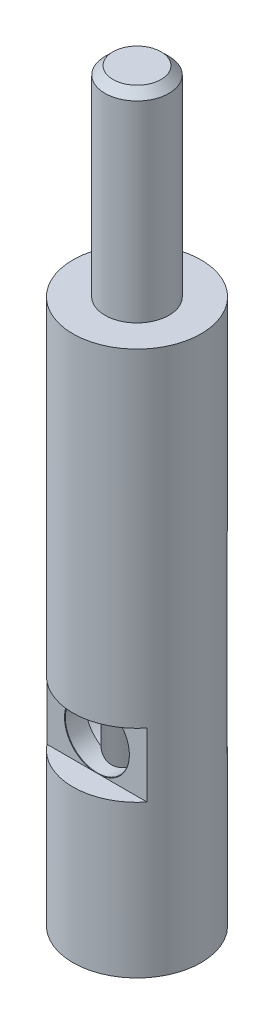
ISO-10303-21;
HEADER;
FILE_DESCRIPTION(('STEP AP214'),'2;1');
FILE_NAME('part.step','',(''),(''),'','','');
FILE_SCHEMA(('AUTOMOTIVE_DESIGN { 1 0 10303 214 1 1 1 1 }'));
ENDSEC;
DATA;
#1=APPLICATION_CONTEXT('core data for automotive mechanical design processes');
#2=APPLICATION_PROTOCOL_DEFINITION('international standard','automotive_design',2000,#1);
#3=PRODUCT_CONTEXT('',#1,'mechanical');
#4=PRODUCT('Part','Part','',(#3));
#5=PRODUCT_RELATED_PRODUCT_CATEGORY('part','',(#4));
#6=PRODUCT_DEFINITION_FORMATION('','',#4);
#7=PRODUCT_DEFINITION_CONTEXT('part definition',#1,'design');
#8=PRODUCT_DEFINITION('design','',#6,#7);
#9=PRODUCT_DEFINITION_SHAPE('','',#8);
#10=(LENGTH_UNIT() NAMED_UNIT(*) SI_UNIT(.MILLI.,.METRE.));
#11=(NAMED_UNIT(*) PLANE_ANGLE_UNIT() SI_UNIT($,.RADIAN.));
#12=(NAMED_UNIT(*) SI_UNIT($,.STERADIAN.) SOLID_ANGLE_UNIT());
#13=UNCERTAINTY_MEASURE_WITH_UNIT(LENGTH_MEASURE(1.E-05),#10,'distance_accuracy_value','');
#14=(GEOMETRIC_REPRESENTATION_CONTEXT(3) GLOBAL_UNCERTAINTY_ASSIGNED_CONTEXT((#13)) GLOBAL_UNIT_ASSIGNED_CONTEXT((#10,
#11,#12)) REPRESENTATION_CONTEXT('',''));
#15=CARTESIAN_POINT('',(0.,0.,0.));
#16=DIRECTION('',(0.,0.,1.));
#17=DIRECTION('',(1.,0.,0.));
#18=AXIS2_PLACEMENT_3D('',#15,#16,#17);
#19=CARTESIAN_POINT('',(-4.,13.5,2.5));
#20=DIRECTION('',(0.,0.,-1.));
#21=DIRECTION('',(0.,1.,0.));
#22=AXIS2_PLACEMENT_3D('',#19,#20,#21);
#23=PLANE('',#22);
#24=DIRECTION('',(1.,0.,0.));
#25=VECTOR('',#24,1.);
#26=CARTESIAN_POINT('',(-4.,13.5,2.5));
#27=LINE('',#26,#25);
#28=CARTESIAN_POINT('',(0.317214438511246,13.5,2.5));
#29=VERTEX_POINT('',#28);
#30=CARTESIAN_POINT('',(3.1224989991992,13.5,2.5));
#31=VERTEX_POINT('',#30);
#32=EDGE_CURVE('E130',#29,#31,#27,.T.);
#33=ORIENTED_EDGE('',*,*,#32,.F.);
#34=CARTESIAN_POINT('',(0.,11.5,2.5));
#35=DIRECTION('',(0.,0.,1.));
#36=DIRECTION('',(1.,0.,0.));
#37=AXIS2_PLACEMENT_3D('',#34,#35,#36);
#38=CIRCLE('',#37,2.025);
#39=CARTESIAN_POINT('',(0.317214438511237,9.5,2.5));
#40=VERTEX_POINT('',#39);
#41=EDGE_CURVE('E140',#40,#29,#38,.T.);
#42=ORIENTED_EDGE('',*,*,#41,.F.);
#43=DIRECTION('',(1.,0.,0.));
#44=VECTOR('',#43,1.);
#45=CARTESIAN_POINT('',(-4.,9.5,2.5));
#46=LINE('',#45,#44);
#47=CARTESIAN_POINT('',(3.1224989991992,9.5,2.5));
#48=VERTEX_POINT('',#47);
#49=EDGE_CURVE('E158',#40,#48,#46,.T.);
#50=ORIENTED_EDGE('',*,*,#49,.T.);
#51=DIRECTION('',(0.,-1.,0.));
#52=VECTOR('',#51,1.);
#53=CARTESIAN_POINT('',(3.1224989991992,34.,2.5));
#54=LINE('',#53,#52);
#55=EDGE_CURVE('E217',#31,#48,#54,.T.);
#56=ORIENTED_EDGE('',*,*,#55,.F.);
#57=EDGE_LOOP('',(#33,#42,#50,#56));
#58=FACE_BOUND('',#57,.T.);
#59=ADVANCED_FACE('F50',(#58),#23,.F.);
#60=CARTESIAN_POINT('',(0.,34.,0.));
#61=DIRECTION('',(0.,-1.,0.));
#62=DIRECTION('',(0.,0.,-1.));
#63=AXIS2_PLACEMENT_3D('',#60,#61,#62);
#64=CYLINDRICAL_SURFACE('',#63,4.);
#65=ORIENTED_EDGE('',*,*,#55,.T.);
#66=CARTESIAN_POINT('',(0.,9.5,0.));
#67=DIRECTION('',(0.,-1.,0.));
#68=DIRECTION('',(0.,0.,-1.));
#69=AXIS2_PLACEMENT_3D('',#66,#67,#68);
#70=CIRCLE('',#69,4.);
#71=CARTESIAN_POINT('',(-3.1224989991992,9.5,2.5));
#72=VERTEX_POINT('',#71);
#73=EDGE_CURVE('E221',#48,#72,#70,.T.);
#74=ORIENTED_EDGE('',*,*,#73,.T.);
#75=DIRECTION('',(0.,-1.,0.));
#76=VECTOR('',#75,1.);
#77=CARTESIAN_POINT('',(-3.1224989991992,34.,2.5));
#78=LINE('',#77,#76);
#79=CARTESIAN_POINT('',(-3.1224989991992,13.5,2.5));
#80=VERTEX_POINT('',#79);
#81=EDGE_CURVE('E214',#72,#80,#78,.F.);
#82=ORIENTED_EDGE('',*,*,#81,.T.);
#83=CARTESIAN_POINT('',(0.,13.5,0.));
#84=DIRECTION('',(0.,1.,0.));
#85=DIRECTION('',(0.,0.,1.));
#86=AXIS2_PLACEMENT_3D('',#83,#84,#85);
#87=CIRCLE('',#86,4.);
#88=EDGE_CURVE('E156',#80,#31,#87,.T.);
#89=ORIENTED_EDGE('',*,*,#88,.T.);
#90=EDGE_LOOP('',(#65,#74,#82,#89));
#91=FACE_BOUND('',#90,.T.);
#92=DIRECTION('',(0.,-1.,0.));
#93=VECTOR('',#92,1.);
#94=CARTESIAN_POINT('',(-3.1224989991992,34.,-2.5));
#95=LINE('',#94,#93);
#96=CARTESIAN_POINT('',(-3.1224989991992,21.5,-2.5));
#97=VERTEX_POINT('',#96);
#98=CARTESIAN_POINT('',(-3.1224989991992,9.5,-2.5));
#99=VERTEX_POINT('',#98);
#100=EDGE_CURVE('E204',#97,#99,#95,.T.);
#101=ORIENTED_EDGE('',*,*,#100,.T.);
#102=CARTESIAN_POINT('',(0.,9.5,0.));
#103=DIRECTION('',(0.,-1.,0.));
#104=DIRECTION('',(0.,0.,-1.));
#105=AXIS2_PLACEMENT_3D('',#102,#103,#104);
#106=CIRCLE('',#105,4.);
#107=CARTESIAN_POINT('',(3.1224989991992,9.5,-2.5));
#108=VERTEX_POINT('',#107);
#109=EDGE_CURVE('E208',#99,#108,#106,.T.);
#110=ORIENTED_EDGE('',*,*,#109,.T.);
#111=DIRECTION('',(0.,-1.,0.));
#112=VECTOR('',#111,1.);
#113=CARTESIAN_POINT('',(3.1224989991992,34.,-2.5));
#114=LINE('',#113,#112);
#115=CARTESIAN_POINT('',(3.1224989991992,21.5,-2.5));
#116=VERTEX_POINT('',#115);
#117=EDGE_CURVE('E201',#108,#116,#114,.F.);
#118=ORIENTED_EDGE('',*,*,#117,.T.);
#119=CARTESIAN_POINT('',(0.,21.5,0.));
#120=DIRECTION('',(0.,1.,0.));
#121=DIRECTION('',(0.,0.,1.));
#122=AXIS2_PLACEMENT_3D('',#119,#120,#121);
#123=CIRCLE('',#122,4.);
#124=EDGE_CURVE('E194',#116,#97,#123,.T.);
#125=ORIENTED_EDGE('',*,*,#124,.T.);
#126=EDGE_LOOP('',(#101,#110,#118,#125));
#127=FACE_BOUND('',#126,.T.);
#128=CARTESIAN_POINT('',(0.,34.,0.));
#129=DIRECTION('',(0.,1.,0.));
#130=DIRECTION('',(0.,0.,1.));
#131=AXIS2_PLACEMENT_3D('',#128,#129,#130);
#132=CIRCLE('',#131,4.);
#133=CARTESIAN_POINT('',(0.,34.,4.));
#134=VERTEX_POINT('',#133);
#135=EDGE_CURVE('E190',#134,#134,#132,.T.);
#136=ORIENTED_EDGE('',*,*,#135,.F.);
#137=EDGE_LOOP('',(#136));
#138=FACE_BOUND('',#137,.T.);
#139=CARTESIAN_POINT('',(0.,0.,0.));
#140=DIRECTION('',(0.,1.,0.));
#141=DIRECTION('',(0.,0.,1.));
#142=AXIS2_PLACEMENT_3D('',#139,#140,#141);
#143=CIRCLE('',#142,4.);
#144=CARTESIAN_POINT('',(0.,0.,4.));
#145=VERTEX_POINT('',#144);
#146=EDGE_CURVE('E189',#145,#145,#143,.T.);
#147=ORIENTED_EDGE('',*,*,#146,.T.);
#148=EDGE_LOOP('',(#147));
#149=FACE_BOUND('',#148,.T.);
#150=ADVANCED_FACE('F52',(#91,#127,#138,#149),#64,.T.);
#151=CARTESIAN_POINT('',(0.,34.,0.));
#152=DIRECTION('',(0.,1.,0.));
#153=DIRECTION('',(0.,0.,1.));
#154=AXIS2_PLACEMENT_3D('',#151,#152,#153);
#155=PLANE('',#154);
#156=CARTESIAN_POINT('',(0.,34.,0.));
#157=DIRECTION('',(0.,1.,0.));
#158=DIRECTION('',(0.,0.,1.));
#159=AXIS2_PLACEMENT_3D('',#156,#157,#158);
#160=CIRCLE('',#159,2.);
#161=CARTESIAN_POINT('',(0.,34.,2.));
#162=VERTEX_POINT('',#161);
#163=EDGE_CURVE('E11',#162,#162,#160,.T.);
#164=ORIENTED_EDGE('',*,*,#163,.F.);
#165=EDGE_LOOP('',(#164));
#166=FACE_BOUND('',#165,.T.);
#167=ORIENTED_EDGE('',*,*,#135,.T.);
#168=EDGE_LOOP('',(#167));
#169=FACE_BOUND('',#168,.T.);
#170=ADVANCED_FACE('F290',(#166,#169),#155,.T.);
#171=CARTESIAN_POINT('',(0.,0.,0.));
#172=DIRECTION('',(0.,1.,0.));
#173=DIRECTION('',(0.,0.,1.));
#174=AXIS2_PLACEMENT_3D('',#171,#172,#173);
#175=PLANE('',#174);
#176=CARTESIAN_POINT('',(0.,0.,0.));
#177=DIRECTION('',(0.,-1.,0.));
#178=DIRECTION('',(0.,0.,-1.));
#179=AXIS2_PLACEMENT_3D('',#176,#177,#178);
#180=CIRCLE('',#179,1.625);
#181=CARTESIAN_POINT('',(0.,0.,-1.625));
#182=VERTEX_POINT('',#181);
#183=EDGE_CURVE('E177',#182,#182,#180,.T.);
#184=ORIENTED_EDGE('',*,*,#183,.F.);
#185=EDGE_LOOP('',(#184));
#186=FACE_BOUND('',#185,.T.);
#187=ORIENTED_EDGE('',*,*,#146,.F.);
#188=EDGE_LOOP('',(#187));
#189=FACE_BOUND('',#188,.T.);
#190=ADVANCED_FACE('F328',(#186,#189),#175,.F.);
#191=CARTESIAN_POINT('',(0.,14.,0.));
#192=DIRECTION('',(0.,-1.,0.));
#193=DIRECTION('',(0.,0.,-1.));
#194=AXIS2_PLACEMENT_3D('',#191,#192,#193);
#195=CONICAL_SURFACE('',#194,1.6,1.02974425867665);
#196=CARTESIAN_POINT('',(0.,14.9613769904441,0.));
#197=VERTEX_POINT('',#196);
#198=VERTEX_LOOP('',#197);
#199=FACE_BOUND('',#198,.T.);
#200=CARTESIAN_POINT('',(0.,14.,0.));
#201=DIRECTION('',(0.,-1.,0.));
#202=DIRECTION('',(0.,0.,-1.));
#203=AXIS2_PLACEMENT_3D('',#200,#201,#202);
#204=CIRCLE('',#203,1.6);
#205=CARTESIAN_POINT('',(0.,14.,-1.6));
#206=VERTEX_POINT('',#205);
#207=EDGE_CURVE('E185',#206,#206,#204,.T.);
#208=ORIENTED_EDGE('',*,*,#207,.T.);
#209=EDGE_LOOP('',(#208));
#210=FACE_BOUND('',#209,.T.);
#211=ADVANCED_FACE('F281',(#199,#210),#195,.F.);
#212=CARTESIAN_POINT('',(0.,0.,0.));
#213=DIRECTION('',(0.,-1.,0.));
#214=DIRECTION('',(0.,0.,-1.));
#215=AXIS2_PLACEMENT_3D('',#212,#213,#214);
#216=CYLINDRICAL_SURFACE('',#215,1.6);
#217=CARTESIAN_POINT('',(1.05634561863401,13.1982738100768,1.20172123805512));
#218=CARTESIAN_POINT('',(1.02660138438575,13.2167739604651,1.22786027240495));
#219=CARTESIAN_POINT('',(0.995760272458903,13.2348737601653,1.2530189190068));
#220=CARTESIAN_POINT('',(0.931863182822248,13.2700182240986,1.3012457164343));
#221=CARTESIAN_POINT('',(0.898805020623123,13.2870618148609,1.32431175114356));
#222=CARTESIAN_POINT('',(0.795809954818795,13.3364375970835,1.39045719837269));
#223=CARTESIAN_POINT('',(0.722537244233979,13.3667042258888,1.43005260819427));
#224=CARTESIAN_POINT('',(0.567779859372484,13.4194656058459,1.49827148551914));
#225=CARTESIAN_POINT('',(0.486246171799129,13.4419099846179,1.52682396523234));
#226=CARTESIAN_POINT('',(0.317846378381121,13.4764360409589,1.57050319790884));
#227=CARTESIAN_POINT('',(0.231005553963776,13.4885632833868,1.5856889942416));
#228=CARTESIAN_POINT('',(0.0673577929632959,13.5003115674321,1.60039384531876));
#229=CARTESIAN_POINT('',(-0.00917798721820051,13.501428850538,1.60178738720816));
#230=CARTESIAN_POINT('',(-0.161318002797394,13.4949358869179,1.5936673714924));
#231=CARTESIAN_POINT('',(-0.236921978433785,13.4873232597758,1.58415083899801));
#232=CARTESIAN_POINT('',(-0.379438932191812,13.464907288513,1.55593305745637));
#233=CARTESIAN_POINT('',(-0.446585645621566,13.450661462117,1.53794285214725));
#234=CARTESIAN_POINT('',(-0.576708056945136,13.4162326429228,1.49403175413212));
#235=CARTESIAN_POINT('',(-0.639677231706247,13.3960406207583,1.4680987978508));
#236=CARTESIAN_POINT('',(-0.766103781090726,13.3487979509186,1.40658742939628));
#237=CARTESIAN_POINT('',(-0.829051792792337,13.3212813176495,1.37033196841572));
#238=CARTESIAN_POINT('',(-0.947954889059054,13.2623267882326,1.29091724543841));
#239=CARTESIAN_POINT('',(-1.00394107550494,13.2309076856477,1.24779080887878));
#240=CARTESIAN_POINT('',(-1.05634561863401,13.1982738100768,1.20172123805512));
#241=B_SPLINE_CURVE_WITH_KNOTS('',3,(#217,#218,#219,#220,#221,#222,#223,#224,#225,#226,#227,
#228,#229,#230,#231,#232,#233,#234,#235,#236,#237,#238,#239,#240),.UNSPECIFIED.,.F.,.F.,(4,2,2,
2,2,2,2,2,2,2,2,4),(0.,0.131065833325742,0.26226276076841,0.526792599849852,0.792995733481469,
1.05801700573743,1.28642664891346,1.51489858818507,1.72691166385949,1.93924835869897,
2.17152332780728,2.40272018063616),.UNSPECIFIED.);
#242=CARTESIAN_POINT('',(1.05634561863401,13.1982738100768,1.20172123805512));
#243=VERTEX_POINT('',#242);
#244=CARTESIAN_POINT('',(-1.05634561863401,13.1982738100768,1.20172123805512));
#245=VERTEX_POINT('',#244);
#246=EDGE_CURVE('E233',#243,#245,#241,.T.);
#247=ORIENTED_EDGE('',*,*,#246,.T.);
#248=CARTESIAN_POINT('',(-0.901148790446978,13.5073354314149,1.32209336186063));
#249=CARTESIAN_POINT('',(-0.922452981196912,13.4712651322541,1.30756660602318));
#250=CARTESIAN_POINT('',(-0.94276577190831,13.4346542258882,1.29297292803859));
#251=CARTESIAN_POINT('',(-0.981563384643306,13.3604996394977,1.26377447814337));
#252=CARTESIAN_POINT('',(-1.00004893328216,13.3229563377382,1.24916971298869));
#253=CARTESIAN_POINT('',(-1.05296715635149,13.2092221345737,1.20554960631562));
#254=CARTESIAN_POINT('',(-1.08492534790039,13.131816164936,1.17668346050792));
#255=CARTESIAN_POINT('',(-1.14352753020944,12.9733499379101,1.11983520721267));
#256=CARTESIAN_POINT('',(-1.17009024449675,12.8922535458894,1.0918713015314));
#257=CARTESIAN_POINT('',(-1.217968804989,12.7277383062893,1.03819301081508));
#258=CARTESIAN_POINT('',(-1.23928124140424,12.6443179883716,1.01248009463394));
#259=CARTESIAN_POINT('',(-1.27882818898743,12.4673402399559,0.962142216059644));
#260=CARTESIAN_POINT('',(-1.29657415728784,12.37357571288,0.937855851361261));
#261=CARTESIAN_POINT('',(-1.32645384157035,12.1838503662583,0.895099171519589));
#262=CARTESIAN_POINT('',(-1.33858922393964,12.0878902077299,0.876627129998517));
#263=CARTESIAN_POINT('',(-1.35722490863554,11.8950309379422,0.847491803149387));
#264=CARTESIAN_POINT('',(-1.3637710148093,11.7981461695588,0.836765158983257));
#265=CARTESIAN_POINT('',(-1.37134921901329,11.6035909396191,0.824293931550584));
#266=CARTESIAN_POINT('',(-1.3723833077412,11.5059207744785,0.822546105539079));
#267=CARTESIAN_POINT('',(-1.36912595312698,11.3220156035637,0.827947357133722));
#268=CARTESIAN_POINT('',(-1.36542431733172,11.2357381438488,0.83411135438167));
#269=CARTESIAN_POINT('',(-1.35371018270726,11.0642012439314,0.852988991429304));
#270=CARTESIAN_POINT('',(-1.34569683112015,10.9789420085209,0.865703926832283));
#271=CARTESIAN_POINT('',(-1.32529782943865,10.8093321028506,0.896620532926028));
#272=CARTESIAN_POINT('',(-1.31288086074706,10.7249925216122,0.914861364742522));
#273=CARTESIAN_POINT('',(-1.28360907896374,10.5581042288577,0.955496888083573));
#274=CARTESIAN_POINT('',(-1.26675349128879,10.4755558326454,0.977892304422721));
#275=CARTESIAN_POINT('',(-1.22873188602294,10.3138721108358,1.02524348737595));
#276=CARTESIAN_POINT('',(-1.20764723084872,10.2347022569285,1.0501470649755));
#277=CARTESIAN_POINT('',(-1.16063935153037,10.0784986375928,1.10187957582267));
#278=CARTESIAN_POINT('',(-1.13471838933574,10.0014638928366,1.12870760540468));
#279=CARTESIAN_POINT('',(-1.07780381159556,9.85071738981607,1.18316299190472));
#280=CARTESIAN_POINT('',(-1.0468742438951,9.7769769936036,1.21077703452519));
#281=CARTESIAN_POINT('',(-0.995902879641263,9.66856617199268,1.25246130416299));
#282=CARTESIAN_POINT('',(-0.978136293639167,9.63277286867864,1.26640925996425));
#283=CARTESIAN_POINT('',(-0.940931355435465,9.56204296815083,1.29428973824805));
#284=CARTESIAN_POINT('',(-0.921492404698585,9.5271066834592,1.30822225338225));
#285=CARTESIAN_POINT('',(-0.901148790446978,9.49266456858515,1.32209336186063));
#286=B_SPLINE_CURVE_WITH_KNOTS('',3,(#248,#249,#250,#251,#252,#253,#254,#255,#256,#257,#258,
#259,#260,#261,#262,#263,#264,#265,#266,#267,#268,#269,#270,#271,#272,#273,#274,#275,#276,#277,
#278,#279,#280,#281,#282,#283,#284,#285),.UNSPECIFIED.,.F.,.F.,(4,2,2,2,2,2,2,2,2,2,2,2,2,2,2,2,
2,2,4),(0.,0.132979757103736,0.265906419351018,0.531354388629104,0.800544859670669,
1.06990969811135,1.36500740340456,1.66001740601482,1.95258595451482,2.24504883299209,
2.50439294382003,2.76378836579322,3.02506688117687,3.28639102251494,3.54310106496871,
3.79969134328017,4.05322762892204,4.18016414118495,4.30714627423005),.UNSPECIFIED.);
#287=CARTESIAN_POINT('',(-1.05634561863401,9.80172618992321,1.20172123805512));
#288=VERTEX_POINT('',#287);
#289=EDGE_CURVE('E54',#245,#288,#286,.T.);
#290=ORIENTED_EDGE('',*,*,#289,.T.);
#291=CARTESIAN_POINT('',(-1.05634561863401,9.80172618992321,1.20172123805512));
#292=CARTESIAN_POINT('',(-1.02660138438575,9.78322603953487,1.22786027240495));
#293=CARTESIAN_POINT('',(-0.995760272458903,9.76512623983469,1.2530189190068));
#294=CARTESIAN_POINT('',(-0.931863182822248,9.7299817759014,1.3012457164343));
#295=CARTESIAN_POINT('',(-0.898805020623123,9.71293818513907,1.32431175114356));
#296=CARTESIAN_POINT('',(-0.795809954818795,9.66356240291651,1.39045719837269));
#297=CARTESIAN_POINT('',(-0.722537244233979,9.63329577411115,1.43005260819427));
#298=CARTESIAN_POINT('',(-0.567779859372484,9.58053439415408,1.49827148551914));
#299=CARTESIAN_POINT('',(-0.486246171799129,9.55809001538206,1.52682396523234));
#300=CARTESIAN_POINT('',(-0.317846378381121,9.52356395904112,1.57050319790884));
#301=CARTESIAN_POINT('',(-0.231005553963776,9.51143671661322,1.5856889942416));
#302=CARTESIAN_POINT('',(-0.0673577929632959,9.49968843256788,1.60039384531876));
#303=CARTESIAN_POINT('',(0.00917798721820051,9.49857114946202,1.60178738720816));
#304=CARTESIAN_POINT('',(0.161318002797394,9.50506411308209,1.5936673714924));
#305=CARTESIAN_POINT('',(0.236921978433785,9.51267674022422,1.58415083899801));
#306=CARTESIAN_POINT('',(0.379438932191812,9.53509271148702,1.55593305745637));
#307=CARTESIAN_POINT('',(0.446585645621566,9.549338537883,1.53794285214725));
#308=CARTESIAN_POINT('',(0.576708056945136,9.58376735707716,1.49403175413212));
#309=CARTESIAN_POINT('',(0.639677231706247,9.60395937924172,1.4680987978508));
#310=CARTESIAN_POINT('',(0.766103781090726,9.65120204908143,1.40658742939628));
#311=CARTESIAN_POINT('',(0.829051792792337,9.67871868235051,1.37033196841572));
#312=CARTESIAN_POINT('',(0.947954889059055,9.73767321176736,1.29091724543841));
#313=CARTESIAN_POINT('',(1.00394107550494,9.76909231435231,1.24779080887878));
#314=CARTESIAN_POINT('',(1.05634561863401,9.80172618992321,1.20172123805512));
#315=B_SPLINE_CURVE_WITH_KNOTS('',3,(#291,#292,#293,#294,#295,#296,#297,#298,#299,#300,#301,
#302,#303,#304,#305,#306,#307,#308,#309,#310,#311,#312,#313,#314),.UNSPECIFIED.,.F.,.F.,(4,2,2,
2,2,2,2,2,2,2,2,4),(0.,0.131065833325742,0.26226276076841,0.526792599849852,0.792995733481469,
1.05801700573743,1.28642664891346,1.51489858818507,1.72691166385949,1.93924835869897,
2.17152332780728,2.40272018063616),.UNSPECIFIED.);
#316=CARTESIAN_POINT('',(1.05634561863401,9.80172618992321,1.20172123805512));
#317=VERTEX_POINT('',#316);
#318=EDGE_CURVE('E574',#288,#317,#315,.T.);
#319=ORIENTED_EDGE('',*,*,#318,.T.);
#320=CARTESIAN_POINT('',(0.901148790446978,9.49266456858514,1.32209336186063));
#321=CARTESIAN_POINT('',(0.922452981196912,9.52873486774587,1.30756660602318));
#322=CARTESIAN_POINT('',(0.94276577190831,9.56534577411182,1.29297292803859));
#323=CARTESIAN_POINT('',(0.981563384643307,9.63950036050234,1.26377447814337));
#324=CARTESIAN_POINT('',(1.00004893328216,9.67704366226177,1.24916971298869));
#325=CARTESIAN_POINT('',(1.05296715635149,9.79077786542634,1.20554960631562));
#326=CARTESIAN_POINT('',(1.08492534790039,9.86818383506401,1.17668346050792));
#327=CARTESIAN_POINT('',(1.14352753020944,10.0266500620899,1.11983520721267));
#328=CARTESIAN_POINT('',(1.17009024449675,10.1077464541106,1.0918713015314));
#329=CARTESIAN_POINT('',(1.217968804989,10.2722616937107,1.03819301081508));
#330=CARTESIAN_POINT('',(1.23928124140424,10.3556820116284,1.01248009463394));
#331=CARTESIAN_POINT('',(1.27882818898743,10.5326597600441,0.962142216059644));
#332=CARTESIAN_POINT('',(1.29657415728784,10.62642428712,0.937855851361261));
#333=CARTESIAN_POINT('',(1.32645384157035,10.8161496337417,0.895099171519589));
#334=CARTESIAN_POINT('',(1.33858922393964,10.9121097922701,0.876627129998517));
#335=CARTESIAN_POINT('',(1.35722490863554,11.1049690620578,0.847491803149387));
#336=CARTESIAN_POINT('',(1.3637710148093,11.2018538304412,0.836765158983257));
#337=CARTESIAN_POINT('',(1.37134921901329,11.3964090603809,0.824293931550584));
#338=CARTESIAN_POINT('',(1.3723833077412,11.4940792255215,0.822546105539079));
#339=CARTESIAN_POINT('',(1.36912595312698,11.6779843964363,0.827947357133722));
#340=CARTESIAN_POINT('',(1.36542431733172,11.7642618561512,0.83411135438167));
#341=CARTESIAN_POINT('',(1.35371018270726,11.9357987560686,0.852988991429304));
#342=CARTESIAN_POINT('',(1.34569683112015,12.0210579914791,0.865703926832283));
#343=CARTESIAN_POINT('',(1.32529782943865,12.1906678971494,0.896620532926028));
#344=CARTESIAN_POINT('',(1.31288086074706,12.2750074783878,0.914861364742522));
#345=CARTESIAN_POINT('',(1.28360907896374,12.4418957711423,0.955496888083573));
#346=CARTESIAN_POINT('',(1.26675349128879,12.5244441673546,0.977892304422721));
#347=CARTESIAN_POINT('',(1.22873188602294,12.6861278891642,1.02524348737595));
#348=CARTESIAN_POINT('',(1.20764723084872,12.7652977430715,1.0501470649755));
#349=CARTESIAN_POINT('',(1.16063935153037,12.9215013624072,1.10187957582267));
#350=CARTESIAN_POINT('',(1.13471838933574,12.9985361071634,1.12870760540468));
#351=CARTESIAN_POINT('',(1.07780381159556,13.1492826101839,1.18316299190472));
#352=CARTESIAN_POINT('',(1.0468742438951,13.2230230063964,1.21077703452519));
#353=CARTESIAN_POINT('',(0.995902879641263,13.3314338280073,1.25246130416299));
#354=CARTESIAN_POINT('',(0.978136293639167,13.3672271313214,1.26640925996425));
#355=CARTESIAN_POINT('',(0.940931355435465,13.4379570318492,1.29428973824805));
#356=CARTESIAN_POINT('',(0.921492404698585,13.4728933165408,1.30822225338225));
#357=CARTESIAN_POINT('',(0.901148790446978,13.5073354314149,1.32209336186063));
#358=B_SPLINE_CURVE_WITH_KNOTS('',3,(#320,#321,#322,#323,#324,#325,#326,#327,#328,#329,#330,
#331,#332,#333,#334,#335,#336,#337,#338,#339,#340,#341,#342,#343,#344,#345,#346,#347,#348,#349,
#350,#351,#352,#353,#354,#355,#356,#357),.UNSPECIFIED.,.F.,.F.,(4,2,2,2,2,2,2,2,2,2,2,2,2,2,2,2,
2,2,4),(0.,0.132979757103738,0.265906419351018,0.531354388629104,0.800544859670667,
1.06990969811135,1.36500740340456,1.66001740601482,1.95258595451482,2.24504883299209,
2.50439294382002,2.76378836579322,3.02506688117687,3.28639102251494,3.54310106496871,
3.79969134328017,4.05322762892204,4.18016414118495,4.30714627423005),.UNSPECIFIED.);
#359=EDGE_CURVE('E225',#317,#243,#358,.T.);
#360=ORIENTED_EDGE('',*,*,#359,.T.);
#361=EDGE_LOOP('',(#247,#290,#319,#360));
#362=FACE_BOUND('',#361,.T.);
#363=ORIENTED_EDGE('',*,*,#207,.F.);
#364=EDGE_LOOP('',(#363));
#365=FACE_BOUND('',#364,.T.);
#366=CARTESIAN_POINT('',(0.,0.0250000000000007,0.));
#367=DIRECTION('',(0.,-1.,0.));
#368=DIRECTION('',(0.,0.,-1.));
#369=AXIS2_PLACEMENT_3D('',#366,#367,#368);
#370=CIRCLE('',#369,1.6);
#371=CARTESIAN_POINT('',(0.,0.0250000000000007,-1.6));
#372=VERTEX_POINT('',#371);
#373=EDGE_CURVE('E181',#372,#372,#370,.T.);
#374=ORIENTED_EDGE('',*,*,#373,.T.);
#375=EDGE_LOOP('',(#374));
#376=FACE_BOUND('',#375,.T.);
#377=ADVANCED_FACE('F239',(#362,#365,#376),#216,.F.);
#378=CARTESIAN_POINT('',(0.,0.,0.));
#379=DIRECTION('',(0.,-1.,0.));
#380=DIRECTION('',(0.,0.,-1.));
#381=AXIS2_PLACEMENT_3D('',#378,#379,#380);
#382=CONICAL_SURFACE('',#381,1.625,0.78539816339747);
#383=ORIENTED_EDGE('',*,*,#373,.F.);
#384=EDGE_LOOP('',(#383));
#385=FACE_BOUND('',#384,.T.);
#386=ORIENTED_EDGE('',*,*,#183,.T.);
#387=EDGE_LOOP('',(#386));
#388=FACE_BOUND('',#387,.T.);
#389=ADVANCED_FACE('F274',(#385,#388),#382,.F.);
#390=CARTESIAN_POINT('',(-4.,9.5,-2.5));
#391=DIRECTION('',(0.,-1.,0.));
#392=DIRECTION('',(0.,0.,-1.));
#393=AXIS2_PLACEMENT_3D('',#390,#391,#392);
#394=PLANE('',#393);
#395=DIRECTION('',(1.,0.,0.));
#396=VECTOR('',#395,1.);
#397=CARTESIAN_POINT('',(-4.,9.5,-2.5));
#398=LINE('',#397,#396);
#399=EDGE_CURVE('E168',#99,#108,#398,.T.);
#400=ORIENTED_EDGE('',*,*,#399,.T.);
#401=ORIENTED_EDGE('',*,*,#109,.F.);
#402=EDGE_LOOP('',(#400,#401));
#403=FACE_BOUND('',#402,.T.);
#404=ADVANCED_FACE('F272',(#403),#394,.F.);
#405=CARTESIAN_POINT('',(-4.,21.5,-2.5));
#406=DIRECTION('',(0.,0.,1.));
#407=DIRECTION('',(0.,-1.,0.));
#408=AXIS2_PLACEMENT_3D('',#405,#406,#407);
#409=PLANE('',#408);
#410=DIRECTION('',(1.,0.,0.));
#411=VECTOR('',#410,1.);
#412=CARTESIAN_POINT('',(-4.,21.5,-2.5));
#413=LINE('',#412,#411);
#414=EDGE_CURVE('E164',#97,#116,#413,.T.);
#415=ORIENTED_EDGE('',*,*,#414,.T.);
#416=ORIENTED_EDGE('',*,*,#117,.F.);
#417=ORIENTED_EDGE('',*,*,#399,.F.);
#418=ORIENTED_EDGE('',*,*,#100,.F.);
#419=EDGE_LOOP('',(#415,#416,#417,#418));
#420=FACE_BOUND('',#419,.T.);
#421=ADVANCED_FACE('F268',(#420),#409,.F.);
#422=CARTESIAN_POINT('',(-4.,21.5,-2.5));
#423=DIRECTION('',(0.,1.,0.));
#424=DIRECTION('',(0.,0.,1.));
#425=AXIS2_PLACEMENT_3D('',#422,#423,#424);
#426=PLANE('',#425);
#427=ORIENTED_EDGE('',*,*,#414,.F.);
#428=ORIENTED_EDGE('',*,*,#124,.F.);
#429=EDGE_LOOP('',(#427,#428));
#430=FACE_BOUND('',#429,.T.);
#431=ADVANCED_FACE('F265',(#430),#426,.F.);
#432=CARTESIAN_POINT('',(-0.317214438511237,9.5,2.5));
#433=VERTEX_POINT('',#432);
#434=EDGE_CURVE('E151',#72,#433,#46,.T.);
#435=ORIENTED_EDGE('',*,*,#434,.T.);
#436=CARTESIAN_POINT('',(-0.317214438511237,13.5,2.5));
#437=VERTEX_POINT('',#436);
#438=EDGE_CURVE('E137',#437,#433,#38,.T.);
#439=ORIENTED_EDGE('',*,*,#438,.F.);
#440=EDGE_CURVE('E129',#80,#437,#27,.T.);
#441=ORIENTED_EDGE('',*,*,#440,.F.);
#442=ORIENTED_EDGE('',*,*,#81,.F.);
#443=EDGE_LOOP('',(#435,#439,#441,#442));
#444=FACE_BOUND('',#443,.T.);
#445=ADVANCED_FACE('F148',(#444),#23,.F.);
#446=CARTESIAN_POINT('',(-4.,9.5,5.5));
#447=DIRECTION('',(0.,-1.,0.));
#448=DIRECTION('',(0.,0.,-1.));
#449=AXIS2_PLACEMENT_3D('',#446,#447,#448);
#450=PLANE('',#449);
#451=ORIENTED_EDGE('',*,*,#434,.F.);
#452=ORIENTED_EDGE('',*,*,#73,.F.);
#453=ORIENTED_EDGE('',*,*,#49,.F.);
#454=EDGE_CURVE('E160',#433,#40,#46,.T.);
#455=ORIENTED_EDGE('',*,*,#454,.F.);
#456=EDGE_LOOP('',(#451,#452,#453,#455));
#457=FACE_BOUND('',#456,.T.);
#458=ADVANCED_FACE('F257',(#457),#450,.F.);
#459=CARTESIAN_POINT('',(-4.,13.5,5.5));
#460=DIRECTION('',(0.,1.,0.));
#461=DIRECTION('',(0.,0.,1.));
#462=AXIS2_PLACEMENT_3D('',#459,#460,#461);
#463=PLANE('',#462);
#464=ORIENTED_EDGE('',*,*,#440,.T.);
#465=EDGE_CURVE('E124',#437,#29,#27,.T.);
#466=ORIENTED_EDGE('',*,*,#465,.T.);
#467=ORIENTED_EDGE('',*,*,#32,.T.);
#468=ORIENTED_EDGE('',*,*,#88,.F.);
#469=EDGE_LOOP('',(#464,#466,#467,#468));
#470=FACE_BOUND('',#469,.T.);
#471=ADVANCED_FACE('F154',(#470),#463,.F.);
#472=CARTESIAN_POINT('',(2.025,11.5,2.5));
#473=DIRECTION('',(0.,0.,1.));
#474=DIRECTION('',(1.,0.,0.));
#475=AXIS2_PLACEMENT_3D('',#472,#473,#474);
#476=PLANE('',#475);
#477=EDGE_CURVE('E153',#433,#40,#38,.T.);
#478=ORIENTED_EDGE('',*,*,#477,.F.);
#479=ORIENTED_EDGE('',*,*,#454,.T.);
#480=EDGE_LOOP('',(#478,#479));
#481=FACE_BOUND('',#480,.T.);
#482=ADVANCED_FACE('F252',(#481),#476,.F.);
#483=EDGE_CURVE('E79',#29,#437,#38,.T.);
#484=ORIENTED_EDGE('',*,*,#483,.F.);
#485=ORIENTED_EDGE('',*,*,#465,.F.);
#486=EDGE_LOOP('',(#484,#485));
#487=FACE_BOUND('',#486,.T.);
#488=ADVANCED_FACE('F125',(#487),#476,.F.);
#489=CARTESIAN_POINT('',(0.,11.5,2.5));
#490=DIRECTION('',(0.,0.,1.));
#491=DIRECTION('',(1.,0.,0.));
#492=AXIS2_PLACEMENT_3D('',#489,#490,#491);
#493=CYLINDRICAL_SURFACE('',#492,2.);
#494=CARTESIAN_POINT('',(0.,11.5,2.475));
#495=DIRECTION('',(0.,0.,1.));
#496=DIRECTION('',(1.,0.,0.));
#497=AXIS2_PLACEMENT_3D('',#494,#495,#496);
#498=CIRCLE('',#497,2.);
#499=CARTESIAN_POINT('',(2.,11.5,2.475));
#500=VERTEX_POINT('',#499);
#501=EDGE_CURVE('E143',#500,#500,#498,.T.);
#502=ORIENTED_EDGE('',*,*,#501,.T.);
#503=EDGE_LOOP('',(#502));
#504=FACE_BOUND('',#503,.T.);
#505=CARTESIAN_POINT('',(0.,11.5,1.20172123805512));
#506=DIRECTION('',(0.,0.,1.));
#507=DIRECTION('',(1.,0.,0.));
#508=AXIS2_PLACEMENT_3D('',#505,#506,#507);
#509=CIRCLE('',#508,2.);
#510=EDGE_CURVE('E174',#245,#288,#509,.T.);
#511=ORIENTED_EDGE('',*,*,#510,.F.);
#512=ORIENTED_EDGE('',*,*,#246,.F.);
#513=EDGE_CURVE('E72',#317,#243,#509,.T.);
#514=ORIENTED_EDGE('',*,*,#513,.F.);
#515=ORIENTED_EDGE('',*,*,#318,.F.);
#516=EDGE_LOOP('',(#511,#512,#514,#515));
#517=FACE_BOUND('',#516,.T.);
#518=ADVANCED_FACE('F248',(#504,#517),#493,.F.);
#519=CARTESIAN_POINT('',(0.,11.5,1.20172123805512));
#520=DIRECTION('',(0.,0.,1.));
#521=DIRECTION('',(1.,0.,0.));
#522=AXIS2_PLACEMENT_3D('',#519,#520,#521);
#523=CONICAL_SURFACE('',#522,2.,1.02974425867665);
#524=ORIENTED_EDGE('',*,*,#510,.T.);
#525=ORIENTED_EDGE('',*,*,#289,.F.);
#526=EDGE_LOOP('',(#524,#525));
#527=FACE_BOUND('',#526,.T.);
#528=ADVANCED_FACE('F243',(#527),#523,.F.);
#529=ORIENTED_EDGE('',*,*,#513,.T.);
#530=ORIENTED_EDGE('',*,*,#359,.F.);
#531=EDGE_LOOP('',(#529,#530));
#532=FACE_BOUND('',#531,.T.);
#533=ADVANCED_FACE('F247',(#532),#523,.F.);
#534=CARTESIAN_POINT('',(0.,11.5,2.5));
#535=DIRECTION('',(0.,0.,1.));
#536=DIRECTION('',(1.,0.,0.));
#537=AXIS2_PLACEMENT_3D('',#534,#535,#536);
#538=CONICAL_SURFACE('',#537,2.025,0.785398163397466);
#539=ORIENTED_EDGE('',*,*,#501,.F.);
#540=EDGE_LOOP('',(#539));
#541=FACE_BOUND('',#540,.T.);
#542=ORIENTED_EDGE('',*,*,#483,.T.);
#543=ORIENTED_EDGE('',*,*,#438,.T.);
#544=ORIENTED_EDGE('',*,*,#477,.T.);
#545=ORIENTED_EDGE('',*,*,#41,.T.);
#546=EDGE_LOOP('',(#542,#543,#544,#545));
#547=FACE_BOUND('',#546,.T.);
#548=ADVANCED_FACE('F135',(#541,#547),#538,.F.);
#549=CARTESIAN_POINT('',(0.,46.,0.));
#550=DIRECTION('',(0.,-1.,0.));
#551=DIRECTION('',(0.,0.,-1.));
#552=AXIS2_PLACEMENT_3D('',#549,#550,#551);
#553=CYLINDRICAL_SURFACE('',#552,2.);
#554=CARTESIAN_POINT('',(0.,46.,0.));
#555=DIRECTION('',(0.,1.,0.));
#556=DIRECTION('',(0.,0.,1.));
#557=AXIS2_PLACEMENT_3D('',#554,#555,#556);
#558=CIRCLE('',#557,2.);
#559=CARTESIAN_POINT('',(0.,46.,2.));
#560=VERTEX_POINT('',#559);
#561=EDGE_CURVE('E303',#560,#560,#558,.T.);
#562=ORIENTED_EDGE('',*,*,#561,.F.);
#563=EDGE_LOOP('',(#562));
#564=FACE_BOUND('',#563,.T.);
#565=ORIENTED_EDGE('',*,*,#163,.T.);
#566=EDGE_LOOP('',(#565));
#567=FACE_BOUND('',#566,.T.);
#568=ADVANCED_FACE('F317',(#564,#567),#553,.T.);
#569=CARTESIAN_POINT('',(0.,46.,0.));
#570=DIRECTION('',(0.,-1.,0.));
#571=DIRECTION('',(0.,0.,1.));
#572=AXIS2_PLACEMENT_3D('',#569,#570,#571);
#573=CONICAL_SURFACE('',#572,2.,0.78539816339745);
#574=CARTESIAN_POINT('',(0.,46.5,0.));
#575=DIRECTION('',(0.,1.,0.));
#576=DIRECTION('',(0.,0.,1.));
#577=AXIS2_PLACEMENT_3D('',#574,#575,#576);
#578=CIRCLE('',#577,1.5);
#579=CARTESIAN_POINT('',(0.,46.5,1.5));
#580=VERTEX_POINT('',#579);
#581=EDGE_CURVE('E307',#580,#580,#578,.T.);
#582=ORIENTED_EDGE('',*,*,#581,.F.);
#583=EDGE_LOOP('',(#582));
#584=FACE_BOUND('',#583,.T.);
#585=ORIENTED_EDGE('',*,*,#561,.T.);
#586=EDGE_LOOP('',(#585));
#587=FACE_BOUND('',#586,.T.);
#588=ADVANCED_FACE('F314',(#584,#587),#573,.T.);
#589=CARTESIAN_POINT('',(0.,46.5,0.));
#590=DIRECTION('',(0.,1.,0.));
#591=DIRECTION('',(0.,0.,1.));
#592=AXIS2_PLACEMENT_3D('',#589,#590,#591);
#593=PLANE('',#592);
#594=ORIENTED_EDGE('',*,*,#581,.T.);
#595=EDGE_LOOP('',(#594));
#596=FACE_BOUND('',#595,.T.);
#597=ADVANCED_FACE('F312',(#596),#593,.T.);
#598=CLOSED_SHELL('',(#59,#150,#170,#190,#211,#377,#389,#404,#421,#431,#445,#458,#471,#482,#488,
#518,#528,#533,#548,#568,#588,#597));
#599=MANIFOLD_SOLID_BREP('B2',#598);
#600=ADVANCED_BREP_SHAPE_REPRESENTATION('',(#18,#599),#14);
#601=SHAPE_DEFINITION_REPRESENTATION(#9,#600);
ENDSEC;
END-ISO-10303-21;
